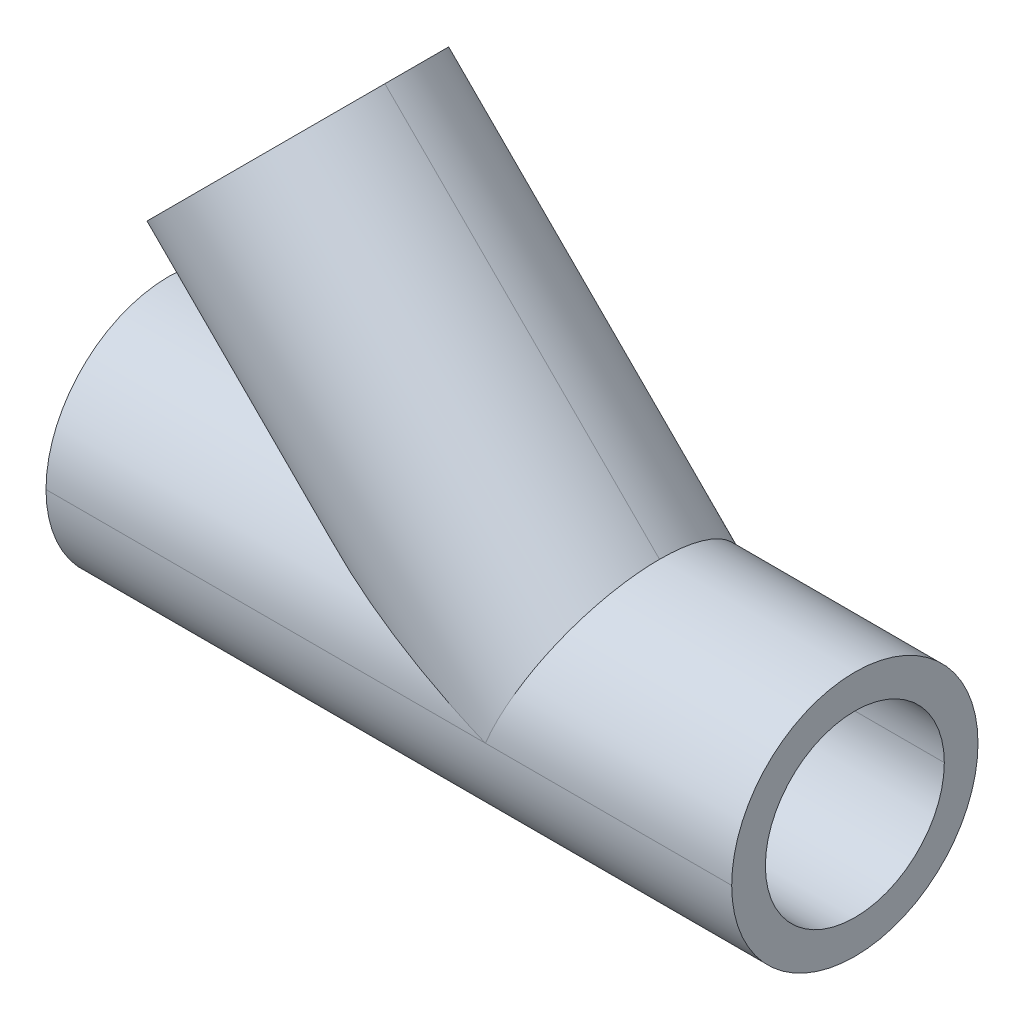
ISO-10303-21;
HEADER;
FILE_DESCRIPTION(('STEP AP214'),'2;1');
FILE_NAME('part.step','',(''),(''),'','','');
FILE_SCHEMA(('AUTOMOTIVE_DESIGN { 1 0 10303 214 1 1 1 1 }'));
ENDSEC;
DATA;
#1=APPLICATION_CONTEXT('core data for automotive mechanical design processes');
#2=APPLICATION_PROTOCOL_DEFINITION('international standard','automotive_design',2000,#1);
#3=PRODUCT_CONTEXT('',#1,'mechanical');
#4=PRODUCT('Part','Part','',(#3));
#5=PRODUCT_RELATED_PRODUCT_CATEGORY('part','',(#4));
#6=PRODUCT_DEFINITION_FORMATION('','',#4);
#7=PRODUCT_DEFINITION_CONTEXT('part definition',#1,'design');
#8=PRODUCT_DEFINITION('design','',#6,#7);
#9=PRODUCT_DEFINITION_SHAPE('','',#8);
#10=(LENGTH_UNIT() NAMED_UNIT(*) SI_UNIT(.MILLI.,.METRE.));
#11=(NAMED_UNIT(*) PLANE_ANGLE_UNIT() SI_UNIT($,.RADIAN.));
#12=(NAMED_UNIT(*) SI_UNIT($,.STERADIAN.) SOLID_ANGLE_UNIT());
#13=UNCERTAINTY_MEASURE_WITH_UNIT(LENGTH_MEASURE(1.E-05),#10,'distance_accuracy_value','');
#14=(GEOMETRIC_REPRESENTATION_CONTEXT(3) GLOBAL_UNCERTAINTY_ASSIGNED_CONTEXT((#13)) GLOBAL_UNIT_ASSIGNED_CONTEXT((#10,
#11,#12)) REPRESENTATION_CONTEXT('',''));
#15=CARTESIAN_POINT('',(0.,0.,0.));
#16=DIRECTION('',(0.,0.,1.));
#17=DIRECTION('',(1.,0.,0.));
#18=AXIS2_PLACEMENT_3D('',#15,#16,#17);
#19=CARTESIAN_POINT('',(17.8593750000005,0.,0.));
#20=DIRECTION('',(1.,0.,0.));
#21=DIRECTION('',(0.,0.,-1.));
#22=AXIS2_PLACEMENT_3D('',#19,#20,#21);
#23=CYLINDRICAL_SURFACE('',#22,10.668);
#24=DIRECTION('',(1.,0.,0.));
#25=VECTOR('',#24,1.);
#26=CARTESIAN_POINT('',(17.8593750000005,0.,10.668));
#27=LINE('',#26,#25);
#28=CARTESIAN_POINT('',(-40.878125,0.,10.668));
#29=VERTEX_POINT('',#28);
#30=CARTESIAN_POINT('',(-18.653125,0.,10.668));
#31=VERTEX_POINT('',#30);
#32=EDGE_CURVE('E314',#29,#31,#27,.T.);
#33=ORIENTED_EDGE('',*,*,#32,.F.);
#34=CARTESIAN_POINT('',(-40.878125,0.,0.));
#35=DIRECTION('',(1.,0.,0.));
#36=DIRECTION('',(0.,0.,-1.));
#37=AXIS2_PLACEMENT_3D('',#34,#35,#36);
#38=CIRCLE('',#37,10.668);
#39=CARTESIAN_POINT('',(-40.878125,0.,-10.668));
#40=VERTEX_POINT('',#39);
#41=EDGE_CURVE('E273',#40,#29,#38,.T.);
#42=ORIENTED_EDGE('',*,*,#41,.F.);
#43=DIRECTION('',(1.,0.,0.));
#44=VECTOR('',#43,1.);
#45=CARTESIAN_POINT('',(17.8593750000005,0.,-10.668));
#46=LINE('',#45,#44);
#47=CARTESIAN_POINT('',(-18.653125,0.,-10.668));
#48=VERTEX_POINT('',#47);
#49=EDGE_CURVE('E330',#40,#48,#46,.T.);
#50=ORIENTED_EDGE('',*,*,#49,.T.);
#51=CARTESIAN_POINT('',(-18.653125,0.,0.));
#52=DIRECTION('',(1.,0.,0.));
#53=DIRECTION('',(0.,0.,-1.));
#54=AXIS2_PLACEMENT_3D('',#51,#52,#53);
#55=CIRCLE('',#54,10.668);
#56=EDGE_CURVE('E11',#48,#31,#55,.T.);
#57=ORIENTED_EDGE('',*,*,#56,.T.);
#58=EDGE_LOOP('',(#33,#42,#50,#57));
#59=FACE_BOUND('',#58,.T.);
#60=ADVANCED_FACE('F16',(#59),#23,.F.);
#61=CARTESIAN_POINT('',(-18.653125,7.8994,0.));
#62=DIRECTION('',(1.,0.,0.));
#63=DIRECTION('',(0.,1.,0.));
#64=AXIS2_PLACEMENT_3D('',#61,#62,#63);
#65=PLANE('',#64);
#66=CARTESIAN_POINT('',(-18.653125,0.,0.));
#67=DIRECTION('',(1.,0.,0.));
#68=DIRECTION('',(0.,0.,-1.));
#69=AXIS2_PLACEMENT_3D('',#66,#67,#68);
#70=CIRCLE('',#69,7.8994);
#71=CARTESIAN_POINT('',(-18.653125,0.,-7.8994));
#72=VERTEX_POINT('',#71);
#73=CARTESIAN_POINT('',(-18.653125,0.,7.8994));
#74=VERTEX_POINT('',#73);
#75=EDGE_CURVE('E235',#72,#74,#70,.T.);
#76=ORIENTED_EDGE('',*,*,#75,.T.);
#77=CARTESIAN_POINT('',(-18.653125,0.,0.));
#78=DIRECTION('',(1.,0.,0.));
#79=DIRECTION('',(0.,0.,-1.));
#80=AXIS2_PLACEMENT_3D('',#77,#78,#79);
#81=CIRCLE('',#80,7.8994);
#82=EDGE_CURVE('E220',#74,#72,#81,.T.);
#83=ORIENTED_EDGE('',*,*,#82,.T.);
#84=EDGE_LOOP('',(#76,#83));
#85=FACE_BOUND('',#84,.T.);
#86=ORIENTED_EDGE('',*,*,#56,.F.);
#87=CARTESIAN_POINT('',(-18.653125,0.,0.));
#88=DIRECTION('',(1.,0.,0.));
#89=DIRECTION('',(0.,0.,-1.));
#90=AXIS2_PLACEMENT_3D('',#87,#88,#89);
#91=CIRCLE('',#90,10.668);
#92=EDGE_CURVE('E359',#31,#48,#91,.T.);
#93=ORIENTED_EDGE('',*,*,#92,.F.);
#94=EDGE_LOOP('',(#86,#93));
#95=FACE_BOUND('',#94,.T.);
#96=ADVANCED_FACE('F655',(#85,#95),#65,.F.);
#97=CARTESIAN_POINT('',(17.859375,10.668,0.));
#98=DIRECTION('',(-1.,0.,0.));
#99=DIRECTION('',(0.,0.,1.));
#100=AXIS2_PLACEMENT_3D('',#97,#98,#99);
#101=PLANE('',#100);
#102=CARTESIAN_POINT('',(17.859375,0.,0.));
#103=DIRECTION('',(1.,0.,0.));
#104=DIRECTION('',(0.,0.,-1.));
#105=AXIS2_PLACEMENT_3D('',#102,#103,#104);
#106=CIRCLE('',#105,7.8994);
#107=CARTESIAN_POINT('',(17.859375,0.,-7.8994));
#108=VERTEX_POINT('',#107);
#109=CARTESIAN_POINT('',(17.859375,0.,7.8994));
#110=VERTEX_POINT('',#109);
#111=EDGE_CURVE('E193',#108,#110,#106,.T.);
#112=ORIENTED_EDGE('',*,*,#111,.F.);
#113=CARTESIAN_POINT('',(17.859375,0.,0.));
#114=DIRECTION('',(1.,0.,0.));
#115=DIRECTION('',(0.,0.,-1.));
#116=AXIS2_PLACEMENT_3D('',#113,#114,#115);
#117=CIRCLE('',#116,7.8994);
#118=EDGE_CURVE('E215',#110,#108,#117,.T.);
#119=ORIENTED_EDGE('',*,*,#118,.F.);
#120=EDGE_LOOP('',(#112,#119));
#121=FACE_BOUND('',#120,.T.);
#122=CARTESIAN_POINT('',(17.859375,0.,0.));
#123=DIRECTION('',(1.,0.,0.));
#124=DIRECTION('',(0.,0.,-1.));
#125=AXIS2_PLACEMENT_3D('',#122,#123,#124);
#126=CIRCLE('',#125,10.668);
#127=CARTESIAN_POINT('',(17.859375,0.,-10.668));
#128=VERTEX_POINT('',#127);
#129=CARTESIAN_POINT('',(17.859375,0.,10.668));
#130=VERTEX_POINT('',#129);
#131=EDGE_CURVE('E27',#128,#130,#126,.T.);
#132=ORIENTED_EDGE('',*,*,#131,.T.);
#133=CARTESIAN_POINT('',(17.859375,0.,0.));
#134=DIRECTION('',(1.,0.,0.));
#135=DIRECTION('',(0.,0.,-1.));
#136=AXIS2_PLACEMENT_3D('',#133,#134,#135);
#137=CIRCLE('',#136,10.668);
#138=EDGE_CURVE('E279',#130,#128,#137,.T.);
#139=ORIENTED_EDGE('',*,*,#138,.T.);
#140=EDGE_LOOP('',(#132,#139));
#141=FACE_BOUND('',#140,.T.);
#142=ADVANCED_FACE('F674',(#121,#141),#101,.F.);
#143=CARTESIAN_POINT('',(17.8593750000005,0.,0.));
#144=DIRECTION('',(1.,0.,0.));
#145=DIRECTION('',(0.,0.,-1.));
#146=AXIS2_PLACEMENT_3D('',#143,#144,#145);
#147=CYLINDRICAL_SURFACE('',#146,10.668);
#148=DIRECTION('',(1.,0.,0.));
#149=VECTOR('',#148,1.);
#150=CARTESIAN_POINT('',(17.8593750000005,0.,10.668));
#151=LINE('',#150,#149);
#152=CARTESIAN_POINT('',(40.878125,0.,10.668));
#153=VERTEX_POINT('',#152);
#154=EDGE_CURVE('E274',#130,#153,#151,.T.);
#155=ORIENTED_EDGE('',*,*,#154,.F.);
#156=ORIENTED_EDGE('',*,*,#131,.F.);
#157=DIRECTION('',(1.,0.,0.));
#158=VECTOR('',#157,1.);
#159=CARTESIAN_POINT('',(17.8593750000005,0.,-10.668));
#160=LINE('',#159,#158);
#161=CARTESIAN_POINT('',(40.878125,0.,-10.668));
#162=VERTEX_POINT('',#161);
#163=EDGE_CURVE('E227',#128,#162,#160,.T.);
#164=ORIENTED_EDGE('',*,*,#163,.T.);
#165=CARTESIAN_POINT('',(40.878125,0.,0.));
#166=DIRECTION('',(1.,0.,0.));
#167=DIRECTION('',(0.,0.,-1.));
#168=AXIS2_PLACEMENT_3D('',#165,#166,#167);
#169=CIRCLE('',#168,10.668);
#170=EDGE_CURVE('E300',#162,#153,#169,.T.);
#171=ORIENTED_EDGE('',*,*,#170,.T.);
#172=EDGE_LOOP('',(#155,#156,#164,#171));
#173=FACE_BOUND('',#172,.T.);
#174=ADVANCED_FACE('F678',(#173),#147,.F.);
#175=CARTESIAN_POINT('',(17.8593750000005,0.,0.));
#176=DIRECTION('',(1.,0.,0.));
#177=DIRECTION('',(0.,0.,-1.));
#178=AXIS2_PLACEMENT_3D('',#175,#176,#177);
#179=CYLINDRICAL_SURFACE('',#178,7.8994);
#180=DIRECTION('',(1.,0.,0.));
#181=VECTOR('',#180,1.);
#182=CARTESIAN_POINT('',(17.8593750000005,0.,7.8994));
#183=LINE('',#182,#181);
#184=CARTESIAN_POINT('',(11.5093749995179,-4.82125624146069E-10,7.8994));
#185=VERTEX_POINT('',#184);
#186=EDGE_CURVE('E208',#185,#110,#183,.T.);
#187=ORIENTED_EDGE('',*,*,#186,.F.);
#188=CARTESIAN_POINT('',(14.7814136141279,7.8994,0.));
#189=CARTESIAN_POINT('',(14.7814136141279,7.8994,4.62736138558111));
#190=CARTESIAN_POINT('',(13.4260908432567,4.62736138516959,7.89940000024107));
#191=CARTESIAN_POINT('',(11.5093749995179,-4.82125624146069E-10,7.8994));
#192=(BOUNDED_CURVE() B_SPLINE_CURVE(3,(#188,#189,#190,#191),.UNSPECIFIED.,.F.,
.F.) B_SPLINE_CURVE_WITH_KNOTS((4,4),(0.,1.57079632684699),
.UNSPECIFIED.) CURVE() GEOMETRIC_REPRESENTATION_ITEM() RATIONAL_B_SPLINE_CURVE((1.,
0.804737854112086,0.804737854112086,1.)) REPRESENTATION_ITEM(''));
#193=CARTESIAN_POINT('',(14.7814136141279,7.8994,0.));
#194=VERTEX_POINT('',#193);
#195=EDGE_CURVE('E121',#194,#185,#192,.T.);
#196=ORIENTED_EDGE('',*,*,#195,.F.);
#197=CARTESIAN_POINT('',(11.5093749995179,-4.82125187407973E-10,-7.8994));
#198=CARTESIAN_POINT('',(13.4260908432567,4.62736138516959,-7.89940000024107));
#199=CARTESIAN_POINT('',(14.7814136141279,7.8994,-4.62736138558111));
#200=CARTESIAN_POINT('',(14.7814136141279,7.8994,0.));
#201=(BOUNDED_CURVE() B_SPLINE_CURVE(3,(#197,#198,#199,#200),.UNSPECIFIED.,.F.,
.F.) B_SPLINE_CURVE_WITH_KNOTS((4,4),(4.71238898033259,6.28318530717959),
.UNSPECIFIED.) CURVE() GEOMETRIC_REPRESENTATION_ITEM() RATIONAL_B_SPLINE_CURVE((1.,
0.804737854112086,0.804737854112086,1.)) REPRESENTATION_ITEM(''));
#202=CARTESIAN_POINT('',(11.5093749995179,-4.82125187407973E-10,-7.8994));
#203=VERTEX_POINT('',#202);
#204=EDGE_CURVE('E205',#203,#194,#201,.T.);
#205=ORIENTED_EDGE('',*,*,#204,.F.);
#206=DIRECTION('',(1.,0.,0.));
#207=VECTOR('',#206,1.);
#208=CARTESIAN_POINT('',(17.8593750000005,0.,-7.8994));
#209=LINE('',#208,#207);
#210=EDGE_CURVE('E236',#203,#108,#209,.T.);
#211=ORIENTED_EDGE('',*,*,#210,.T.);
#212=ORIENTED_EDGE('',*,*,#111,.T.);
#213=EDGE_LOOP('',(#187,#196,#205,#211,#212));
#214=FACE_BOUND('',#213,.T.);
#215=ADVANCED_FACE('F209',(#214),#179,.F.);
#216=CARTESIAN_POINT('',(-25.5341814996513,37.0435564991692,0.));
#217=DIRECTION('',(-0.707106781186548,0.707106781186547,0.));
#218=DIRECTION('',(-0.707106781186547,-0.707106781186548,0.));
#219=AXIS2_PLACEMENT_3D('',#216,#217,#218);
#220=CYLINDRICAL_SURFACE('',#219,7.8994);
#221=DIRECTION('',(-0.707106781186548,0.707106781186547,0.));
#222=VECTOR('',#221,1.);
#223=CARTESIAN_POINT('',(-19.9484621923463,42.6292758064742,0.));
#224=LINE('',#223,#222);
#225=CARTESIAN_POINT('',(-4.23301398047528,26.9138275946032,0.));
#226=VERTEX_POINT('',#225);
#227=EDGE_CURVE('E190',#194,#226,#224,.T.);
#228=ORIENTED_EDGE('',*,*,#227,.F.);
#229=ORIENTED_EDGE('',*,*,#195,.T.);
#230=CARTESIAN_POINT('',(11.5093749995179,-4.82125624146069E-10,7.8994));
#231=CARTESIAN_POINT('',(0.337936384999142,4.62736138535216,7.89940000004136));
#232=CARTESIAN_POINT('',(-7.56146361509216,7.89940000000001,4.62736138542277));
#233=CARTESIAN_POINT('',(-7.56146361509218,7.8994,0.));
#234=(BOUNDED_CURVE() B_SPLINE_CURVE(3,(#230,#231,#232,#233),.UNSPECIFIED.,.F.,
.F.) B_SPLINE_CURVE_WITH_KNOTS((4,4),(4.71238898037575,6.28318530717959),
.UNSPECIFIED.) CURVE() GEOMETRIC_REPRESENTATION_ITEM() RATIONAL_B_SPLINE_CURVE((1.,
0.804737854122258,0.804737854122258,1.)) REPRESENTATION_ITEM(''));
#235=CARTESIAN_POINT('',(-7.56146361509218,7.8994,0.));
#236=VERTEX_POINT('',#235);
#237=EDGE_CURVE('E187',#185,#236,#234,.T.);
#238=ORIENTED_EDGE('',*,*,#237,.T.);
#239=DIRECTION('',(-0.707106781186548,0.707106781186547,0.));
#240=VECTOR('',#239,1.);
#241=CARTESIAN_POINT('',(-31.1199008069563,31.4578371918641,0.));
#242=LINE('',#241,#240);
#243=CARTESIAN_POINT('',(-15.4044525950853,15.7423889799931,0.));
#244=VERTEX_POINT('',#243);
#245=EDGE_CURVE('E134',#236,#244,#242,.T.);
#246=ORIENTED_EDGE('',*,*,#245,.T.);
#247=CARTESIAN_POINT('',(-9.8187332877803,21.3281082872982,0.));
#248=DIRECTION('',(-0.707106781186548,0.707106781186547,0.));
#249=DIRECTION('',(-0.707106781186547,-0.707106781186548,0.));
#250=AXIS2_PLACEMENT_3D('',#247,#248,#249);
#251=CIRCLE('',#250,7.8994);
#252=EDGE_CURVE('E194',#244,#226,#251,.T.);
#253=ORIENTED_EDGE('',*,*,#252,.T.);
#254=EDGE_LOOP('',(#228,#229,#238,#246,#253));
#255=FACE_BOUND('',#254,.T.);
#256=ADVANCED_FACE('F186',(#255),#220,.F.);
#257=CARTESIAN_POINT('',(-17.3621484294784,13.7846931456001,0.));
#258=DIRECTION('',(0.707106781186548,-0.707106781186547,0.));
#259=DIRECTION('',(0.,0.,-1.));
#260=AXIS2_PLACEMENT_3D('',#257,#258,#259);
#261=PLANE('',#260);
#262=ORIENTED_EDGE('',*,*,#252,.F.);
#263=CARTESIAN_POINT('',(-9.8187332877803,21.3281082872982,0.));
#264=DIRECTION('',(-0.707106781186548,0.707106781186547,0.));
#265=DIRECTION('',(-0.707106781186547,-0.707106781186548,0.));
#266=AXIS2_PLACEMENT_3D('',#263,#264,#265);
#267=CIRCLE('',#266,7.8994);
#268=EDGE_CURVE('E253',#226,#244,#267,.T.);
#269=ORIENTED_EDGE('',*,*,#268,.F.);
#270=EDGE_LOOP('',(#262,#269));
#271=FACE_BOUND('',#270,.T.);
#272=CARTESIAN_POINT('',(-9.8187332877803,21.3281082872982,0.));
#273=DIRECTION('',(-0.707106781186548,0.707106781186547,0.));
#274=DIRECTION('',(-0.707106781186547,-0.707106781186548,0.));
#275=AXIS2_PLACEMENT_3D('',#272,#273,#274);
#276=CIRCLE('',#275,10.668);
#277=CARTESIAN_POINT('',(-17.3621484294784,13.7846931456001,0.));
#278=VERTEX_POINT('',#277);
#279=CARTESIAN_POINT('',(-2.27531814608223,28.8715234289963,0.));
#280=VERTEX_POINT('',#279);
#281=EDGE_CURVE('E306',#278,#280,#276,.T.);
#282=ORIENTED_EDGE('',*,*,#281,.T.);
#283=CARTESIAN_POINT('',(-9.8187332877803,21.3281082872982,0.));
#284=DIRECTION('',(-0.707106781186548,0.707106781186547,0.));
#285=DIRECTION('',(-0.707106781186547,-0.707106781186548,0.));
#286=AXIS2_PLACEMENT_3D('',#283,#284,#285);
#287=CIRCLE('',#286,10.668);
#288=EDGE_CURVE('E252',#280,#278,#287,.T.);
#289=ORIENTED_EDGE('',*,*,#288,.T.);
#290=EDGE_LOOP('',(#282,#289));
#291=FACE_BOUND('',#290,.T.);
#292=ADVANCED_FACE('F666',(#271,#291),#261,.F.);
#293=CARTESIAN_POINT('',(-25.5341814996513,37.0435564991692,0.));
#294=DIRECTION('',(-0.707106781186548,0.707106781186547,0.));
#295=DIRECTION('',(-0.707106781186547,-0.707106781186548,0.));
#296=AXIS2_PLACEMENT_3D('',#293,#294,#295);
#297=CYLINDRICAL_SURFACE('',#296,10.668);
#298=DIRECTION('',(-0.707106781186548,0.707106781186547,0.));
#299=VECTOR('',#298,1.);
#300=CARTESIAN_POINT('',(-17.9907663579532,44.5869716408672,0.));
#301=LINE('',#300,#299);
#302=CARTESIAN_POINT('',(-17.9907663579532,44.5869716408672,0.));
#303=VERTEX_POINT('',#302);
#304=EDGE_CURVE('E260',#280,#303,#301,.T.);
#305=ORIENTED_EDGE('',*,*,#304,.F.);
#306=ORIENTED_EDGE('',*,*,#281,.F.);
#307=DIRECTION('',(-0.707106781186548,0.707106781186547,0.));
#308=VECTOR('',#307,1.);
#309=CARTESIAN_POINT('',(-33.0775966413494,29.5001413574711,0.));
#310=LINE('',#309,#308);
#311=CARTESIAN_POINT('',(-33.0775966413494,29.5001413574711,0.));
#312=VERTEX_POINT('',#311);
#313=EDGE_CURVE('E254',#278,#312,#310,.T.);
#314=ORIENTED_EDGE('',*,*,#313,.T.);
#315=CARTESIAN_POINT('',(-25.5341814996513,37.0435564991691,0.));
#316=DIRECTION('',(-0.707106781186548,0.707106781186547,0.));
#317=DIRECTION('',(-0.707106781186547,-0.707106781186548,0.));
#318=AXIS2_PLACEMENT_3D('',#315,#316,#317);
#319=CIRCLE('',#318,10.668);
#320=EDGE_CURVE('E303',#312,#303,#319,.T.);
#321=ORIENTED_EDGE('',*,*,#320,.T.);
#322=EDGE_LOOP('',(#305,#306,#314,#321));
#323=FACE_BOUND('',#322,.T.);
#324=ADVANCED_FACE('F644',(#323),#297,.F.);
#325=CARTESIAN_POINT('',(-35.9176026393964,26.6601353594241,0.));
#326=DIRECTION('',(0.707106781186546,-0.707106781186549,0.));
#327=DIRECTION('',(0.,0.,-1.));
#328=AXIS2_PLACEMENT_3D('',#325,#326,#327);
#329=PLANE('',#328);
#330=ORIENTED_EDGE('',*,*,#320,.F.);
#331=CARTESIAN_POINT('',(-25.5341814996513,37.0435564991691,0.));
#332=DIRECTION('',(-0.707106781186548,0.707106781186547,0.));
#333=DIRECTION('',(-0.707106781186547,-0.707106781186548,0.));
#334=AXIS2_PLACEMENT_3D('',#331,#332,#333);
#335=CIRCLE('',#334,10.668);
#336=EDGE_CURVE('E259',#303,#312,#335,.T.);
#337=ORIENTED_EDGE('',*,*,#336,.F.);
#338=EDGE_LOOP('',(#330,#337));
#339=FACE_BOUND('',#338,.T.);
#340=CARTESIAN_POINT('',(-25.5341814994102,37.0435564994103,0.));
#341=DIRECTION('',(0.707106781186546,-0.707106781186549,0.));
#342=DIRECTION('',(0.707106781186549,0.707106781186546,0.));
#343=AXIS2_PLACEMENT_3D('',#340,#341,#342);
#344=CIRCLE('',#343,14.684375);
#345=CARTESIAN_POINT('',(-15.150760359424,47.4269776393965,0.));
#346=VERTEX_POINT('',#345);
#347=CARTESIAN_POINT('',(-35.9176026393964,26.6601353594241,0.));
#348=VERTEX_POINT('',#347);
#349=EDGE_CURVE('E258',#346,#348,#344,.T.);
#350=ORIENTED_EDGE('',*,*,#349,.F.);
#351=CARTESIAN_POINT('',(-25.5341814994102,37.0435564994103,0.));
#352=DIRECTION('',(0.707106781186546,-0.707106781186549,0.));
#353=DIRECTION('',(0.707106781186549,0.707106781186546,0.));
#354=AXIS2_PLACEMENT_3D('',#351,#352,#353);
#355=CIRCLE('',#354,14.684375);
#356=EDGE_CURVE('E146',#348,#346,#355,.T.);
#357=ORIENTED_EDGE('',*,*,#356,.F.);
#358=EDGE_LOOP('',(#350,#357));
#359=FACE_BOUND('',#358,.T.);
#360=ADVANCED_FACE('F639',(#339,#359),#329,.F.);
#361=CARTESIAN_POINT('',(-22.9184744398564,34.4278494398566,0.));
#362=DIRECTION('',(0.707106781186546,-0.707106781186549,0.));
#363=DIRECTION('',(0.707106781186549,0.707106781186546,0.));
#364=AXIS2_PLACEMENT_3D('',#361,#362,#363);
#365=CYLINDRICAL_SURFACE('',#364,14.684375);
#366=DIRECTION('',(0.707106781186546,-0.707106781186549,0.));
#367=VECTOR('',#366,1.);
#368=CARTESIAN_POINT('',(-33.3018955798426,24.0444282998704,0.));
#369=LINE('',#368,#367);
#370=CARTESIAN_POINT('',(-23.9418422799723,14.684375,0.));
#371=VERTEX_POINT('',#370);
#372=EDGE_CURVE('E244',#348,#371,#369,.T.);
#373=ORIENTED_EDGE('',*,*,#372,.F.);
#374=ORIENTED_EDGE('',*,*,#356,.T.);
#375=DIRECTION('',(0.707106781186546,-0.707106781186549,0.));
#376=VECTOR('',#375,1.);
#377=CARTESIAN_POINT('',(-12.5350532998702,44.8112705798427,0.));
#378=LINE('',#377,#376);
#379=CARTESIAN_POINT('',(17.5918422799725,14.684375,0.));
#380=VERTEX_POINT('',#379);
#381=EDGE_CURVE('E334',#346,#380,#378,.T.);
#382=ORIENTED_EDGE('',*,*,#381,.T.);
#383=CARTESIAN_POINT('',(17.5918422799725,14.684375,0.));
#384=CARTESIAN_POINT('',(17.5918422799725,14.684375,-8.60190772002758));
#385=CARTESIAN_POINT('',(15.0724018399173,8.60190772002759,-14.684375));
#386=CARTESIAN_POINT('',(11.509375,0.,-14.684375));
#387=(BOUNDED_CURVE() B_SPLINE_CURVE(3,(#383,#384,#385,#386),.UNSPECIFIED.,.F.,
.F.) B_SPLINE_CURVE_WITH_KNOTS((4,4),(3.1415926535898,4.71238898038469),
.UNSPECIFIED.) CURVE() GEOMETRIC_REPRESENTATION_ITEM() RATIONAL_B_SPLINE_CURVE((1.,
0.804737854124365,0.804737854124365,1.)) REPRESENTATION_ITEM(''));
#388=CARTESIAN_POINT('',(11.509375,0.,-14.684375));
#389=VERTEX_POINT('',#388);
#390=EDGE_CURVE('E295',#380,#389,#387,.T.);
#391=ORIENTED_EDGE('',*,*,#390,.T.);
#392=CARTESIAN_POINT('',(11.509375,0.,-14.684375));
#393=CARTESIAN_POINT('',(-9.25746727997234,8.60190772002758,-14.684375));
#394=CARTESIAN_POINT('',(-23.9418422799723,14.684375,-8.60190772002759));
#395=CARTESIAN_POINT('',(-23.9418422799723,14.684375,0.));
#396=(BOUNDED_CURVE() B_SPLINE_CURVE(3,(#392,#393,#394,#395),.UNSPECIFIED.,.F.,
.F.) B_SPLINE_CURVE_WITH_KNOTS((4,4),(4.71238898038469,6.28318530717959),
.UNSPECIFIED.) CURVE() GEOMETRIC_REPRESENTATION_ITEM() RATIONAL_B_SPLINE_CURVE((1.,
0.804737854124365,0.804737854124365,1.)) REPRESENTATION_ITEM(''));
#397=EDGE_CURVE('E294',#389,#371,#396,.T.);
#398=ORIENTED_EDGE('',*,*,#397,.T.);
#399=EDGE_LOOP('',(#373,#374,#382,#391,#398));
#400=FACE_BOUND('',#399,.T.);
#401=ADVANCED_FACE('F643',(#400),#365,.T.);
#402=CARTESIAN_POINT('',(40.878125,14.684375,0.));
#403=DIRECTION('',(-1.,0.,0.));
#404=DIRECTION('',(0.,0.,1.));
#405=AXIS2_PLACEMENT_3D('',#402,#403,#404);
#406=PLANE('',#405);
#407=ORIENTED_EDGE('',*,*,#170,.F.);
#408=CARTESIAN_POINT('',(40.878125,0.,0.));
#409=DIRECTION('',(1.,0.,0.));
#410=DIRECTION('',(0.,0.,-1.));
#411=AXIS2_PLACEMENT_3D('',#408,#409,#410);
#412=CIRCLE('',#411,10.668);
#413=EDGE_CURVE('E278',#153,#162,#412,.T.);
#414=ORIENTED_EDGE('',*,*,#413,.F.);
#415=EDGE_LOOP('',(#407,#414));
#416=FACE_BOUND('',#415,.T.);
#417=CARTESIAN_POINT('',(40.878125,0.,0.));
#418=DIRECTION('',(-1.,0.,0.));
#419=DIRECTION('',(0.,0.,1.));
#420=AXIS2_PLACEMENT_3D('',#417,#418,#419);
#421=CIRCLE('',#420,14.684375);
#422=CARTESIAN_POINT('',(40.878125,0.,14.684375));
#423=VERTEX_POINT('',#422);
#424=CARTESIAN_POINT('',(40.878125,0.,-14.684375));
#425=VERTEX_POINT('',#424);
#426=EDGE_CURVE('E337',#423,#425,#421,.T.);
#427=ORIENTED_EDGE('',*,*,#426,.F.);
#428=CARTESIAN_POINT('',(40.878125,0.,0.));
#429=DIRECTION('',(-1.,0.,0.));
#430=DIRECTION('',(0.,0.,1.));
#431=AXIS2_PLACEMENT_3D('',#428,#429,#430);
#432=CIRCLE('',#431,14.684375);
#433=EDGE_CURVE('E267',#425,#423,#432,.T.);
#434=ORIENTED_EDGE('',*,*,#433,.F.);
#435=EDGE_LOOP('',(#427,#434));
#436=FACE_BOUND('',#435,.T.);
#437=ADVANCED_FACE('F689',(#416,#436),#406,.F.);
#438=CARTESIAN_POINT('',(-40.878125,0.,0.));
#439=DIRECTION('',(1.,0.,0.));
#440=DIRECTION('',(0.,1.,0.));
#441=AXIS2_PLACEMENT_3D('',#438,#439,#440);
#442=PLANE('',#441);
#443=ORIENTED_EDGE('',*,*,#41,.T.);
#444=CARTESIAN_POINT('',(-40.878125,0.,0.));
#445=DIRECTION('',(1.,0.,0.));
#446=DIRECTION('',(0.,0.,-1.));
#447=AXIS2_PLACEMENT_3D('',#444,#445,#446);
#448=CIRCLE('',#447,10.668);
#449=EDGE_CURVE('E310',#29,#40,#448,.T.);
#450=ORIENTED_EDGE('',*,*,#449,.T.);
#451=EDGE_LOOP('',(#443,#450));
#452=FACE_BOUND('',#451,.T.);
#453=CARTESIAN_POINT('',(-40.878125,0.,0.));
#454=DIRECTION('',(-1.,0.,0.));
#455=DIRECTION('',(0.,0.,1.));
#456=AXIS2_PLACEMENT_3D('',#453,#454,#455);
#457=CIRCLE('',#456,14.684375);
#458=CARTESIAN_POINT('',(-40.878125,0.,14.684375));
#459=VERTEX_POINT('',#458);
#460=CARTESIAN_POINT('',(-40.878125,0.,-14.684375));
#461=VERTEX_POINT('',#460);
#462=EDGE_CURVE('E268',#459,#461,#457,.T.);
#463=ORIENTED_EDGE('',*,*,#462,.T.);
#464=CARTESIAN_POINT('',(-40.878125,0.,0.));
#465=DIRECTION('',(-1.,0.,0.));
#466=DIRECTION('',(0.,0.,1.));
#467=AXIS2_PLACEMENT_3D('',#464,#465,#466);
#468=CIRCLE('',#467,14.684375);
#469=EDGE_CURVE('E41',#461,#459,#468,.T.);
#470=ORIENTED_EDGE('',*,*,#469,.T.);
#471=EDGE_LOOP('',(#463,#470));
#472=FACE_BOUND('',#471,.T.);
#473=ADVANCED_FACE('F599',(#452,#472),#442,.F.);
#474=CARTESIAN_POINT('',(0.,0.,0.));
#475=DIRECTION('',(-1.,0.,0.));
#476=DIRECTION('',(0.,0.,1.));
#477=AXIS2_PLACEMENT_3D('',#474,#475,#476);
#478=CYLINDRICAL_SURFACE('',#477,14.684375);
#479=DIRECTION('',(-1.,0.,0.));
#480=VECTOR('',#479,1.);
#481=CARTESIAN_POINT('',(0.,0.,-14.684375));
#482=LINE('',#481,#480);
#483=EDGE_CURVE('E20',#425,#389,#482,.T.);
#484=ORIENTED_EDGE('',*,*,#483,.F.);
#485=ORIENTED_EDGE('',*,*,#433,.T.);
#486=DIRECTION('',(-1.,0.,0.));
#487=VECTOR('',#486,1.);
#488=CARTESIAN_POINT('',(0.,0.,14.684375));
#489=LINE('',#488,#487);
#490=CARTESIAN_POINT('',(11.509375,0.,14.684375));
#491=VERTEX_POINT('',#490);
#492=EDGE_CURVE('E290',#423,#491,#489,.T.);
#493=ORIENTED_EDGE('',*,*,#492,.T.);
#494=DIRECTION('',(-1.,0.,0.));
#495=VECTOR('',#494,1.);
#496=CARTESIAN_POINT('',(0.,0.,14.684375));
#497=LINE('',#496,#495);
#498=EDGE_CURVE('E264',#491,#459,#497,.T.);
#499=ORIENTED_EDGE('',*,*,#498,.T.);
#500=ORIENTED_EDGE('',*,*,#469,.F.);
#501=DIRECTION('',(-1.,0.,0.));
#502=VECTOR('',#501,1.);
#503=CARTESIAN_POINT('',(0.,0.,-14.684375));
#504=LINE('',#503,#502);
#505=EDGE_CURVE('E296',#389,#461,#504,.T.);
#506=ORIENTED_EDGE('',*,*,#505,.F.);
#507=EDGE_LOOP('',(#484,#485,#493,#499,#500,#506));
#508=FACE_BOUND('',#507,.T.);
#509=ADVANCED_FACE('F593',(#508),#478,.T.);
#510=CARTESIAN_POINT('',(0.,0.,0.));
#511=DIRECTION('',(-1.,0.,0.));
#512=DIRECTION('',(0.,0.,1.));
#513=AXIS2_PLACEMENT_3D('',#510,#511,#512);
#514=CYLINDRICAL_SURFACE('',#513,14.684375);
#515=ORIENTED_EDGE('',*,*,#397,.F.);
#516=ORIENTED_EDGE('',*,*,#505,.T.);
#517=ORIENTED_EDGE('',*,*,#462,.F.);
#518=ORIENTED_EDGE('',*,*,#498,.F.);
#519=CARTESIAN_POINT('',(-23.9418422799723,14.684375,0.));
#520=CARTESIAN_POINT('',(-23.9418422799723,14.684375,8.60190772002759));
#521=CARTESIAN_POINT('',(-9.25746727997234,8.60190772002758,14.684375));
#522=CARTESIAN_POINT('',(11.509375,0.,14.684375));
#523=(BOUNDED_CURVE() B_SPLINE_CURVE(3,(#519,#520,#521,#522),.UNSPECIFIED.,.F.,
.F.) B_SPLINE_CURVE_WITH_KNOTS((4,4),(0.,1.5707963267949),
.UNSPECIFIED.) CURVE() GEOMETRIC_REPRESENTATION_ITEM() RATIONAL_B_SPLINE_CURVE((1.,
0.804737854124365,0.804737854124365,1.)) REPRESENTATION_ITEM(''));
#524=EDGE_CURVE('E237',#371,#491,#523,.T.);
#525=ORIENTED_EDGE('',*,*,#524,.F.);
#526=EDGE_LOOP('',(#515,#516,#517,#518,#525));
#527=FACE_BOUND('',#526,.T.);
#528=ADVANCED_FACE('F598',(#527),#514,.T.);
#529=CARTESIAN_POINT('',(0.,0.,0.));
#530=DIRECTION('',(-1.,0.,0.));
#531=DIRECTION('',(0.,0.,1.));
#532=AXIS2_PLACEMENT_3D('',#529,#530,#531);
#533=CYLINDRICAL_SURFACE('',#532,14.684375);
#534=ORIENTED_EDGE('',*,*,#426,.T.);
#535=ORIENTED_EDGE('',*,*,#483,.T.);
#536=ORIENTED_EDGE('',*,*,#390,.F.);
#537=CARTESIAN_POINT('',(11.509375,0.,14.684375));
#538=CARTESIAN_POINT('',(15.0724018399173,8.60190772002758,14.684375));
#539=CARTESIAN_POINT('',(17.5918422799724,14.684375,8.60190772002759));
#540=CARTESIAN_POINT('',(17.5918422799725,14.684375,0.));
#541=(BOUNDED_CURVE() B_SPLINE_CURVE(3,(#537,#538,#539,#540),.UNSPECIFIED.,.F.,
.F.) B_SPLINE_CURVE_WITH_KNOTS((4,4),(1.5707963267949,3.1415926535898),
.UNSPECIFIED.) CURVE() GEOMETRIC_REPRESENTATION_ITEM() RATIONAL_B_SPLINE_CURVE((1.,
0.804737854124365,0.804737854124365,1.)) REPRESENTATION_ITEM(''));
#542=EDGE_CURVE('E243',#491,#380,#541,.T.);
#543=ORIENTED_EDGE('',*,*,#542,.F.);
#544=ORIENTED_EDGE('',*,*,#492,.F.);
#545=EDGE_LOOP('',(#534,#535,#536,#543,#544));
#546=FACE_BOUND('',#545,.T.);
#547=ADVANCED_FACE('F18',(#546),#533,.T.);
#548=CARTESIAN_POINT('',(-22.9184744398564,34.4278494398566,0.));
#549=DIRECTION('',(0.707106781186546,-0.707106781186549,0.));
#550=DIRECTION('',(0.707106781186549,0.707106781186546,0.));
#551=AXIS2_PLACEMENT_3D('',#548,#549,#550);
#552=CYLINDRICAL_SURFACE('',#551,14.684375);
#553=ORIENTED_EDGE('',*,*,#349,.T.);
#554=ORIENTED_EDGE('',*,*,#372,.T.);
#555=ORIENTED_EDGE('',*,*,#524,.T.);
#556=ORIENTED_EDGE('',*,*,#542,.T.);
#557=ORIENTED_EDGE('',*,*,#381,.F.);
#558=EDGE_LOOP('',(#553,#554,#555,#556,#557));
#559=FACE_BOUND('',#558,.T.);
#560=ADVANCED_FACE('F622',(#559),#552,.T.);
#561=CARTESIAN_POINT('',(-25.5341814996513,37.0435564991692,0.));
#562=DIRECTION('',(-0.707106781186548,0.707106781186547,0.));
#563=DIRECTION('',(-0.707106781186547,-0.707106781186548,0.));
#564=AXIS2_PLACEMENT_3D('',#561,#562,#563);
#565=CYLINDRICAL_SURFACE('',#564,10.668);
#566=ORIENTED_EDGE('',*,*,#288,.F.);
#567=ORIENTED_EDGE('',*,*,#304,.T.);
#568=ORIENTED_EDGE('',*,*,#336,.T.);
#569=ORIENTED_EDGE('',*,*,#313,.F.);
#570=EDGE_LOOP('',(#566,#567,#568,#569));
#571=FACE_BOUND('',#570,.T.);
#572=ADVANCED_FACE('F617',(#571),#565,.F.);
#573=CARTESIAN_POINT('',(-25.5341814996513,37.0435564991692,0.));
#574=DIRECTION('',(-0.707106781186548,0.707106781186547,0.));
#575=DIRECTION('',(-0.707106781186547,-0.707106781186548,0.));
#576=AXIS2_PLACEMENT_3D('',#573,#574,#575);
#577=CYLINDRICAL_SURFACE('',#576,7.8994);
#578=ORIENTED_EDGE('',*,*,#204,.T.);
#579=ORIENTED_EDGE('',*,*,#227,.T.);
#580=ORIENTED_EDGE('',*,*,#268,.T.);
#581=ORIENTED_EDGE('',*,*,#245,.F.);
#582=CARTESIAN_POINT('',(-7.56146361509218,7.8994,0.));
#583=CARTESIAN_POINT('',(-7.56146361509216,7.89940000000001,-4.62736138542277));
#584=CARTESIAN_POINT('',(0.337936384999139,4.62736138535216,-7.89940000004136));
#585=CARTESIAN_POINT('',(11.5093749995179,-4.82125187407973E-10,-7.8994));
#586=(BOUNDED_CURVE() B_SPLINE_CURVE(3,(#582,#583,#584,#585),.UNSPECIFIED.,.F.,
.F.) B_SPLINE_CURVE_WITH_KNOTS((4,4),(0.,1.57079632680383),
.UNSPECIFIED.) CURVE() GEOMETRIC_REPRESENTATION_ITEM() RATIONAL_B_SPLINE_CURVE((1.,
0.804737854122258,0.804737854122258,1.)) REPRESENTATION_ITEM(''));
#587=EDGE_CURVE('E203',#236,#203,#586,.T.);
#588=ORIENTED_EDGE('',*,*,#587,.T.);
#589=EDGE_LOOP('',(#578,#579,#580,#581,#588));
#590=FACE_BOUND('',#589,.T.);
#591=ADVANCED_FACE('F621',(#590),#577,.F.);
#592=CARTESIAN_POINT('',(17.8593750000005,0.,0.));
#593=DIRECTION('',(1.,0.,0.));
#594=DIRECTION('',(0.,0.,-1.));
#595=AXIS2_PLACEMENT_3D('',#592,#593,#594);
#596=CYLINDRICAL_SURFACE('',#595,7.8994);
#597=DIRECTION('',(1.,0.,0.));
#598=VECTOR('',#597,1.);
#599=CARTESIAN_POINT('',(17.8593750000005,0.,7.8994));
#600=LINE('',#599,#598);
#601=EDGE_CURVE('E200',#74,#185,#600,.T.);
#602=ORIENTED_EDGE('',*,*,#601,.F.);
#603=ORIENTED_EDGE('',*,*,#75,.F.);
#604=DIRECTION('',(1.,0.,0.));
#605=VECTOR('',#604,1.);
#606=CARTESIAN_POINT('',(17.8593750000005,0.,-7.8994));
#607=LINE('',#606,#605);
#608=EDGE_CURVE('E232',#72,#203,#607,.T.);
#609=ORIENTED_EDGE('',*,*,#608,.T.);
#610=ORIENTED_EDGE('',*,*,#587,.F.);
#611=ORIENTED_EDGE('',*,*,#237,.F.);
#612=EDGE_LOOP('',(#602,#603,#609,#610,#611));
#613=FACE_BOUND('',#612,.T.);
#614=ADVANCED_FACE('F198',(#613),#596,.F.);
#615=CARTESIAN_POINT('',(17.8593750000005,0.,0.));
#616=DIRECTION('',(1.,0.,0.));
#617=DIRECTION('',(0.,0.,-1.));
#618=AXIS2_PLACEMENT_3D('',#615,#616,#617);
#619=CYLINDRICAL_SURFACE('',#618,7.8994);
#620=ORIENTED_EDGE('',*,*,#82,.F.);
#621=ORIENTED_EDGE('',*,*,#601,.T.);
#622=ORIENTED_EDGE('',*,*,#186,.T.);
#623=ORIENTED_EDGE('',*,*,#118,.T.);
#624=ORIENTED_EDGE('',*,*,#210,.F.);
#625=ORIENTED_EDGE('',*,*,#608,.F.);
#626=EDGE_LOOP('',(#620,#621,#622,#623,#624,#625));
#627=FACE_BOUND('',#626,.T.);
#628=ADVANCED_FACE('F217',(#627),#619,.F.);
#629=CARTESIAN_POINT('',(17.8593750000005,0.,0.));
#630=DIRECTION('',(1.,0.,0.));
#631=DIRECTION('',(0.,0.,-1.));
#632=AXIS2_PLACEMENT_3D('',#629,#630,#631);
#633=CYLINDRICAL_SURFACE('',#632,10.668);
#634=ORIENTED_EDGE('',*,*,#138,.F.);
#635=ORIENTED_EDGE('',*,*,#154,.T.);
#636=ORIENTED_EDGE('',*,*,#413,.T.);
#637=ORIENTED_EDGE('',*,*,#163,.F.);
#638=EDGE_LOOP('',(#634,#635,#636,#637));
#639=FACE_BOUND('',#638,.T.);
#640=ADVANCED_FACE('F610',(#639),#633,.F.);
#641=CARTESIAN_POINT('',(17.8593750000005,0.,0.));
#642=DIRECTION('',(1.,0.,0.));
#643=DIRECTION('',(0.,0.,-1.));
#644=AXIS2_PLACEMENT_3D('',#641,#642,#643);
#645=CYLINDRICAL_SURFACE('',#644,10.668);
#646=ORIENTED_EDGE('',*,*,#449,.F.);
#647=ORIENTED_EDGE('',*,*,#32,.T.);
#648=ORIENTED_EDGE('',*,*,#92,.T.);
#649=ORIENTED_EDGE('',*,*,#49,.F.);
#650=EDGE_LOOP('',(#646,#647,#648,#649));
#651=FACE_BOUND('',#650,.T.);
#652=ADVANCED_FACE('F700',(#651),#645,.F.);
#653=CLOSED_SHELL('',(#60,#96,#142,#174,#215,#256,#292,#324,#360,#401,#437,#473,#509,#528,#547,
#560,#572,#591,#614,#628,#640,#652));
#654=MANIFOLD_SOLID_BREP('B1',#653);
#655=ADVANCED_BREP_SHAPE_REPRESENTATION('',(#18,#654),#14);
#656=SHAPE_DEFINITION_REPRESENTATION(#9,#655);
ENDSEC;
END-ISO-10303-21;
